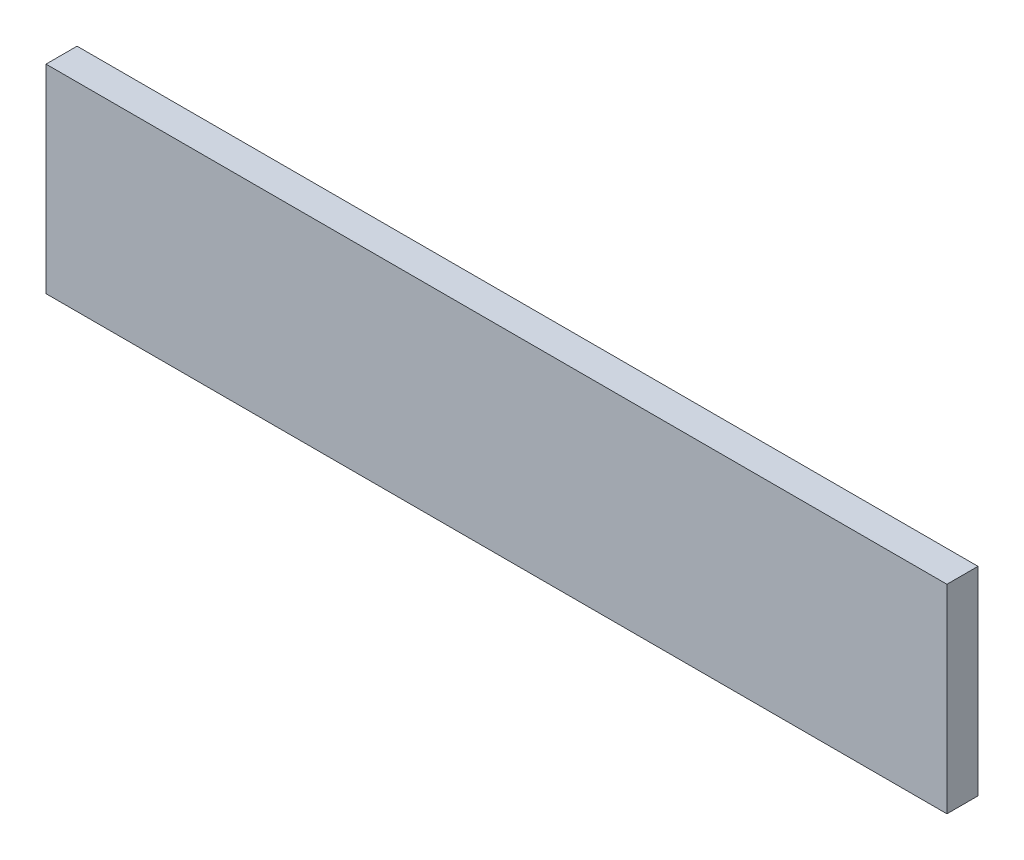
ISO-10303-21;
HEADER;
FILE_DESCRIPTION(('STEP AP214'),'2;1');
FILE_NAME('part.step','',(''),(''),'','','');
FILE_SCHEMA(('AUTOMOTIVE_DESIGN { 1 0 10303 214 1 1 1 1 }'));
ENDSEC;
DATA;
#1=APPLICATION_CONTEXT('core data for automotive mechanical design processes');
#2=APPLICATION_PROTOCOL_DEFINITION('international standard','automotive_design',2000,#1);
#3=PRODUCT_CONTEXT('',#1,'mechanical');
#4=PRODUCT('Part','Part','',(#3));
#5=PRODUCT_RELATED_PRODUCT_CATEGORY('part','',(#4));
#6=PRODUCT_DEFINITION_FORMATION('','',#4);
#7=PRODUCT_DEFINITION_CONTEXT('part definition',#1,'design');
#8=PRODUCT_DEFINITION('design','',#6,#7);
#9=PRODUCT_DEFINITION_SHAPE('','',#8);
#10=(LENGTH_UNIT() NAMED_UNIT(*) SI_UNIT(.MILLI.,.METRE.));
#11=(NAMED_UNIT(*) PLANE_ANGLE_UNIT() SI_UNIT($,.RADIAN.));
#12=(NAMED_UNIT(*) SI_UNIT($,.STERADIAN.) SOLID_ANGLE_UNIT());
#13=UNCERTAINTY_MEASURE_WITH_UNIT(LENGTH_MEASURE(1.E-05),#10,'distance_accuracy_value','');
#14=(GEOMETRIC_REPRESENTATION_CONTEXT(3) GLOBAL_UNCERTAINTY_ASSIGNED_CONTEXT((#13)) GLOBAL_UNIT_ASSIGNED_CONTEXT((#10,
#11,#12)) REPRESENTATION_CONTEXT('',''));
#15=CARTESIAN_POINT('',(0.,0.,0.));
#16=DIRECTION('',(0.,0.,1.));
#17=DIRECTION('',(1.,0.,0.));
#18=AXIS2_PLACEMENT_3D('',#15,#16,#17);
#19=CARTESIAN_POINT('',(-178.704435935817,-23.3948879177451,-264.66388846191));
#20=DIRECTION('',(1.,0.,0.));
#21=DIRECTION('',(0.,0.,-1.));
#22=AXIS2_PLACEMENT_3D('',#19,#20,#21);
#23=PLANE('',#22);
#24=DIRECTION('',(0.,1.,0.));
#25=VECTOR('',#24,1.);
#26=CARTESIAN_POINT('',(-178.704435935817,-23.3948879177451,-254.66388846191));
#27=LINE('',#26,#25);
#28=CARTESIAN_POINT('',(-178.704435935817,-23.3948879177451,-254.66388846191));
#29=VERTEX_POINT('',#28);
#30=CARTESIAN_POINT('',(-178.704435935817,40.6051120822549,-254.66388846191));
#31=VERTEX_POINT('',#30);
#32=EDGE_CURVE('E96',#29,#31,#27,.T.);
#33=ORIENTED_EDGE('',*,*,#32,.T.);
#34=DIRECTION('',(0.,0.,1.));
#35=VECTOR('',#34,1.);
#36=CARTESIAN_POINT('',(-178.704435935817,40.6051120822549,-264.66388846191));
#37=LINE('',#36,#35);
#38=CARTESIAN_POINT('',(-178.704435935817,40.6051120822549,-264.66388846191));
#39=VERTEX_POINT('',#38);
#40=EDGE_CURVE('E11',#39,#31,#37,.T.);
#41=ORIENTED_EDGE('',*,*,#40,.F.);
#42=DIRECTION('',(0.,1.,0.));
#43=VECTOR('',#42,1.);
#44=CARTESIAN_POINT('',(-178.704435935817,-23.3948879177451,-264.66388846191));
#45=LINE('',#44,#43);
#46=CARTESIAN_POINT('',(-178.704435935817,-23.3948879177451,-264.66388846191));
#47=VERTEX_POINT('',#46);
#48=EDGE_CURVE('E84',#47,#39,#45,.T.);
#49=ORIENTED_EDGE('',*,*,#48,.F.);
#50=DIRECTION('',(0.,0.,1.));
#51=VECTOR('',#50,1.);
#52=CARTESIAN_POINT('',(-178.704435935817,-23.3948879177451,-264.66388846191));
#53=LINE('',#52,#51);
#54=EDGE_CURVE('E92',#47,#29,#53,.T.);
#55=ORIENTED_EDGE('',*,*,#54,.T.);
#56=EDGE_LOOP('',(#33,#41,#49,#55));
#57=FACE_BOUND('',#56,.T.);
#58=ADVANCED_FACE('F33',(#57),#23,.F.);
#59=CARTESIAN_POINT('',(111.295564064183,40.6051120822549,-264.66388846191));
#60=DIRECTION('',(0.,-1.,0.));
#61=DIRECTION('',(0.,0.,-1.));
#62=AXIS2_PLACEMENT_3D('',#59,#60,#61);
#63=PLANE('',#62);
#64=DIRECTION('',(1.,0.,0.));
#65=VECTOR('',#64,1.);
#66=CARTESIAN_POINT('',(111.295564064183,40.6051120822549,-254.66388846191));
#67=LINE('',#66,#65);
#68=CARTESIAN_POINT('',(111.295564064183,40.6051120822549,-254.66388846191));
#69=VERTEX_POINT('',#68);
#70=EDGE_CURVE('E88',#31,#69,#67,.T.);
#71=ORIENTED_EDGE('',*,*,#70,.T.);
#72=DIRECTION('',(0.,0.,1.));
#73=VECTOR('',#72,1.);
#74=CARTESIAN_POINT('',(111.295564064183,40.6051120822549,-264.66388846191));
#75=LINE('',#74,#73);
#76=CARTESIAN_POINT('',(111.295564064183,40.6051120822549,-264.66388846191));
#77=VERTEX_POINT('',#76);
#78=EDGE_CURVE('E41',#77,#69,#75,.T.);
#79=ORIENTED_EDGE('',*,*,#78,.F.);
#80=DIRECTION('',(1.,0.,0.));
#81=VECTOR('',#80,1.);
#82=CARTESIAN_POINT('',(111.295564064183,40.6051120822549,-264.66388846191));
#83=LINE('',#82,#81);
#84=EDGE_CURVE('E79',#39,#77,#83,.T.);
#85=ORIENTED_EDGE('',*,*,#84,.F.);
#86=ORIENTED_EDGE('',*,*,#40,.T.);
#87=EDGE_LOOP('',(#71,#79,#85,#86));
#88=FACE_BOUND('',#87,.T.);
#89=ADVANCED_FACE('F87',(#88),#63,.F.);
#90=CARTESIAN_POINT('',(111.295564064183,-23.3948879177451,-264.66388846191));
#91=DIRECTION('',(-1.,0.,0.));
#92=DIRECTION('',(0.,0.,1.));
#93=AXIS2_PLACEMENT_3D('',#90,#91,#92);
#94=PLANE('',#93);
#95=DIRECTION('',(0.,-1.,0.));
#96=VECTOR('',#95,1.);
#97=CARTESIAN_POINT('',(111.295564064183,-23.3948879177451,-254.66388846191));
#98=LINE('',#97,#96);
#99=CARTESIAN_POINT('',(111.295564064183,-23.3948879177451,-254.66388846191));
#100=VERTEX_POINT('',#99);
#101=EDGE_CURVE('E66',#69,#100,#98,.T.);
#102=ORIENTED_EDGE('',*,*,#101,.T.);
#103=DIRECTION('',(0.,0.,1.));
#104=VECTOR('',#103,1.);
#105=CARTESIAN_POINT('',(111.295564064183,-23.3948879177451,-264.66388846191));
#106=LINE('',#105,#104);
#107=CARTESIAN_POINT('',(111.295564064183,-23.3948879177451,-264.66388846191));
#108=VERTEX_POINT('',#107);
#109=EDGE_CURVE('E89',#108,#100,#106,.T.);
#110=ORIENTED_EDGE('',*,*,#109,.F.);
#111=DIRECTION('',(0.,-1.,0.));
#112=VECTOR('',#111,1.);
#113=CARTESIAN_POINT('',(111.295564064183,-23.3948879177451,-264.66388846191));
#114=LINE('',#113,#112);
#115=EDGE_CURVE('E82',#77,#108,#114,.T.);
#116=ORIENTED_EDGE('',*,*,#115,.F.);
#117=ORIENTED_EDGE('',*,*,#78,.T.);
#118=EDGE_LOOP('',(#102,#110,#116,#117));
#119=FACE_BOUND('',#118,.T.);
#120=ADVANCED_FACE('F90',(#119),#94,.F.);
#121=CARTESIAN_POINT('',(111.295564064183,-23.3948879177451,-264.66388846191));
#122=DIRECTION('',(0.,1.,0.));
#123=DIRECTION('',(0.,0.,1.));
#124=AXIS2_PLACEMENT_3D('',#121,#122,#123);
#125=PLANE('',#124);
#126=DIRECTION('',(-1.,0.,0.));
#127=VECTOR('',#126,1.);
#128=CARTESIAN_POINT('',(111.295564064183,-23.3948879177451,-254.66388846191));
#129=LINE('',#128,#127);
#130=EDGE_CURVE('E72',#100,#29,#129,.T.);
#131=ORIENTED_EDGE('',*,*,#130,.T.);
#132=ORIENTED_EDGE('',*,*,#54,.F.);
#133=DIRECTION('',(-1.,0.,0.));
#134=VECTOR('',#133,1.);
#135=CARTESIAN_POINT('',(111.295564064183,-23.3948879177451,-264.66388846191));
#136=LINE('',#135,#134);
#137=EDGE_CURVE('E49',#108,#47,#136,.T.);
#138=ORIENTED_EDGE('',*,*,#137,.F.);
#139=ORIENTED_EDGE('',*,*,#109,.T.);
#140=EDGE_LOOP('',(#131,#132,#138,#139));
#141=FACE_BOUND('',#140,.T.);
#142=ADVANCED_FACE('F103',(#141),#125,.F.);
#143=CARTESIAN_POINT('',(0.,0.,-264.66388846191));
#144=DIRECTION('',(0.,0.,1.));
#145=DIRECTION('',(1.,0.,0.));
#146=AXIS2_PLACEMENT_3D('',#143,#144,#145);
#147=PLANE('',#146);
#148=ORIENTED_EDGE('',*,*,#48,.T.);
#149=ORIENTED_EDGE('',*,*,#84,.T.);
#150=ORIENTED_EDGE('',*,*,#115,.T.);
#151=ORIENTED_EDGE('',*,*,#137,.T.);
#152=EDGE_LOOP('',(#148,#149,#150,#151));
#153=FACE_BOUND('',#152,.T.);
#154=ADVANCED_FACE('F80',(#153),#147,.F.);
#155=CARTESIAN_POINT('',(0.,0.,-254.66388846191));
#156=DIRECTION('',(0.,0.,1.));
#157=DIRECTION('',(1.,0.,0.));
#158=AXIS2_PLACEMENT_3D('',#155,#156,#157);
#159=PLANE('',#158);
#160=ORIENTED_EDGE('',*,*,#32,.F.);
#161=ORIENTED_EDGE('',*,*,#130,.F.);
#162=ORIENTED_EDGE('',*,*,#101,.F.);
#163=ORIENTED_EDGE('',*,*,#70,.F.);
#164=EDGE_LOOP('',(#160,#161,#162,#163));
#165=FACE_BOUND('',#164,.T.);
#166=ADVANCED_FACE('F106',(#165),#159,.T.);
#167=CLOSED_SHELL('',(#58,#89,#120,#142,#154,#166));
#168=MANIFOLD_SOLID_BREP('B2',#167);
#169=ADVANCED_BREP_SHAPE_REPRESENTATION('',(#18,#168),#14);
#170=SHAPE_DEFINITION_REPRESENTATION(#9,#169);
ENDSEC;
END-ISO-10303-21;
